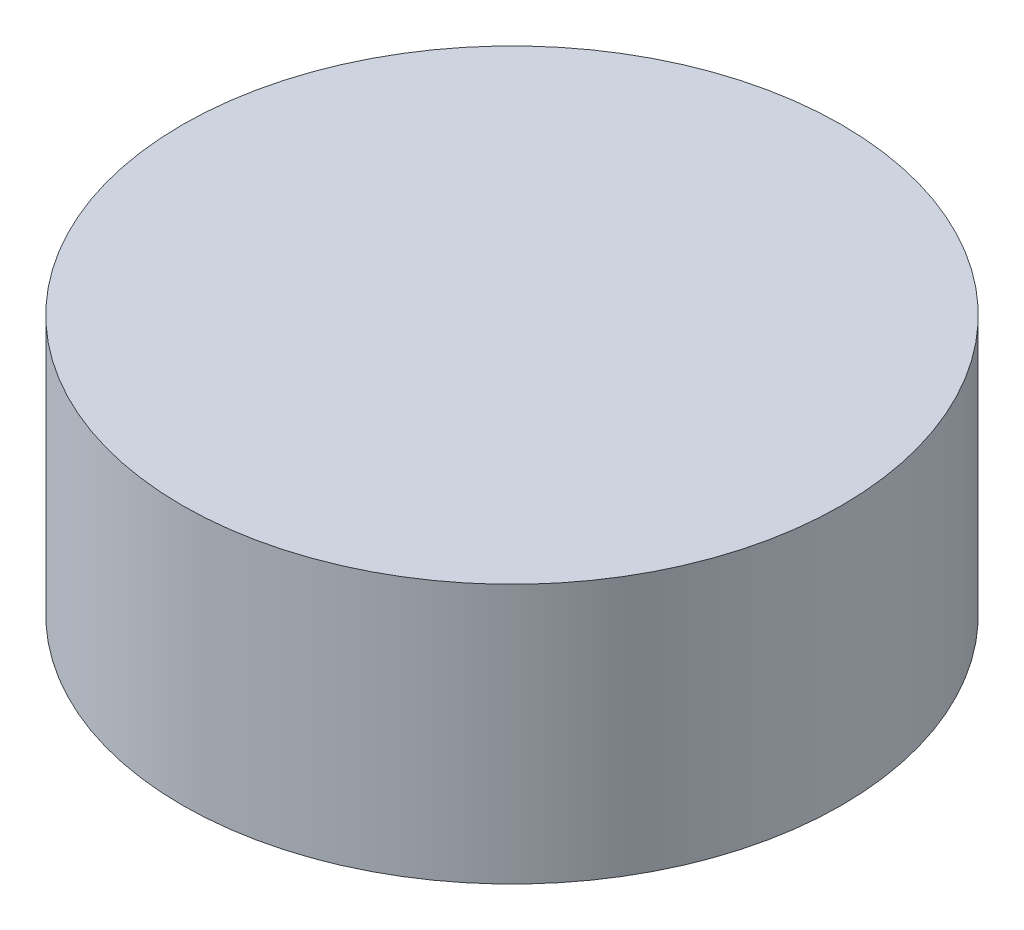
ISO-10303-21;
HEADER;
FILE_DESCRIPTION(('STEP AP214'),'2;1');
FILE_NAME('part.step','',(''),(''),'','','');
FILE_SCHEMA(('AUTOMOTIVE_DESIGN { 1 0 10303 214 1 1 1 1 }'));
ENDSEC;
DATA;
#1=APPLICATION_CONTEXT('core data for automotive mechanical design processes');
#2=APPLICATION_PROTOCOL_DEFINITION('international standard','automotive_design',2000,#1);
#3=PRODUCT_CONTEXT('',#1,'mechanical');
#4=PRODUCT('Part','Part','',(#3));
#5=PRODUCT_RELATED_PRODUCT_CATEGORY('part','',(#4));
#6=PRODUCT_DEFINITION_FORMATION('','',#4);
#7=PRODUCT_DEFINITION_CONTEXT('part definition',#1,'design');
#8=PRODUCT_DEFINITION('design','',#6,#7);
#9=PRODUCT_DEFINITION_SHAPE('','',#8);
#10=(LENGTH_UNIT() NAMED_UNIT(*) SI_UNIT(.MILLI.,.METRE.));
#11=(NAMED_UNIT(*) PLANE_ANGLE_UNIT() SI_UNIT($,.RADIAN.));
#12=(NAMED_UNIT(*) SI_UNIT($,.STERADIAN.) SOLID_ANGLE_UNIT());
#13=UNCERTAINTY_MEASURE_WITH_UNIT(LENGTH_MEASURE(1.E-05),#10,'distance_accuracy_value','');
#14=(GEOMETRIC_REPRESENTATION_CONTEXT(3) GLOBAL_UNCERTAINTY_ASSIGNED_CONTEXT((#13)) GLOBAL_UNIT_ASSIGNED_CONTEXT((#10,
#11,#12)) REPRESENTATION_CONTEXT('',''));
#15=CARTESIAN_POINT('',(0.,0.,0.));
#16=DIRECTION('',(0.,0.,1.));
#17=DIRECTION('',(1.,0.,0.));
#18=AXIS2_PLACEMENT_3D('',#15,#16,#17);
#19=CARTESIAN_POINT('',(0.,5.,0.));
#20=DIRECTION('',(0.,-1.,0.));
#21=DIRECTION('',(0.,0.,-1.));
#22=AXIS2_PLACEMENT_3D('',#19,#20,#21);
#23=CYLINDRICAL_SURFACE('',#22,6.35);
#24=CARTESIAN_POINT('',(0.,5.,0.));
#25=DIRECTION('',(0.,1.,0.));
#26=DIRECTION('',(0.,0.,1.));
#27=AXIS2_PLACEMENT_3D('',#24,#25,#26);
#28=CIRCLE('',#27,6.35);
#29=CARTESIAN_POINT('',(0.,5.,6.35));
#30=VERTEX_POINT('',#29);
#31=EDGE_CURVE('E11',#30,#30,#28,.T.);
#32=ORIENTED_EDGE('',*,*,#31,.F.);
#33=EDGE_LOOP('',(#32));
#34=FACE_BOUND('',#33,.T.);
#35=CARTESIAN_POINT('',(0.,0.,0.));
#36=DIRECTION('',(0.,1.,0.));
#37=DIRECTION('',(0.,0.,1.));
#38=AXIS2_PLACEMENT_3D('',#35,#36,#37);
#39=CIRCLE('',#38,6.35);
#40=CARTESIAN_POINT('',(0.,0.,6.35));
#41=VERTEX_POINT('',#40);
#42=EDGE_CURVE('E48',#41,#41,#39,.T.);
#43=ORIENTED_EDGE('',*,*,#42,.T.);
#44=EDGE_LOOP('',(#43));
#45=FACE_BOUND('',#44,.T.);
#46=ADVANCED_FACE('F45',(#34,#45),#23,.T.);
#47=CARTESIAN_POINT('',(0.,5.,0.));
#48=DIRECTION('',(0.,1.,0.));
#49=DIRECTION('',(0.,0.,1.));
#50=AXIS2_PLACEMENT_3D('',#47,#48,#49);
#51=PLANE('',#50);
#52=ORIENTED_EDGE('',*,*,#31,.T.);
#53=EDGE_LOOP('',(#52));
#54=FACE_BOUND('',#53,.T.);
#55=ADVANCED_FACE('F74',(#54),#51,.T.);
#56=CARTESIAN_POINT('',(0.,0.,0.));
#57=DIRECTION('',(0.,1.,0.));
#58=DIRECTION('',(0.,0.,1.));
#59=AXIS2_PLACEMENT_3D('',#56,#57,#58);
#60=PLANE('',#59);
#61=CARTESIAN_POINT('',(0.,0.,0.));
#62=DIRECTION('',(0.,-1.,0.));
#63=DIRECTION('',(0.,0.,-1.));
#64=AXIS2_PLACEMENT_3D('',#61,#62,#63);
#65=CIRCLE('',#64,1.13029999999999);
#66=CARTESIAN_POINT('',(0.,0.,-1.13029999999999));
#67=VERTEX_POINT('',#66);
#68=EDGE_CURVE('E64',#67,#67,#65,.T.);
#69=ORIENTED_EDGE('',*,*,#68,.F.);
#70=EDGE_LOOP('',(#69));
#71=FACE_BOUND('',#70,.T.);
#72=ORIENTED_EDGE('',*,*,#42,.F.);
#73=EDGE_LOOP('',(#72));
#74=FACE_BOUND('',#73,.T.);
#75=ADVANCED_FACE('F58',(#71,#74),#60,.F.);
#76=CARTESIAN_POINT('',(0.,2.286,0.));
#77=DIRECTION('',(0.,-1.,0.));
#78=DIRECTION('',(0.,0.,-1.));
#79=AXIS2_PLACEMENT_3D('',#76,#77,#78);
#80=CONICAL_SURFACE('',#79,1.1303,1.02974425867665);
#81=CARTESIAN_POINT('',(0.,2.96515275768685,0.));
#82=VERTEX_POINT('',#81);
#83=VERTEX_LOOP('',#82);
#84=FACE_BOUND('',#83,.T.);
#85=CARTESIAN_POINT('',(0.,2.286,0.));
#86=DIRECTION('',(0.,-1.,0.));
#87=DIRECTION('',(0.,0.,-1.));
#88=AXIS2_PLACEMENT_3D('',#85,#86,#87);
#89=CIRCLE('',#88,1.1303);
#90=CARTESIAN_POINT('',(0.,2.286,-1.1303));
#91=VERTEX_POINT('',#90);
#92=EDGE_CURVE('E62',#91,#91,#89,.T.);
#93=ORIENTED_EDGE('',*,*,#92,.T.);
#94=EDGE_LOOP('',(#93));
#95=FACE_BOUND('',#94,.T.);
#96=ADVANCED_FACE('F54',(#84,#95),#80,.F.);
#97=CARTESIAN_POINT('',(0.,0.,0.));
#98=DIRECTION('',(0.,-1.,0.));
#99=DIRECTION('',(0.,0.,-1.));
#100=AXIS2_PLACEMENT_3D('',#97,#98,#99);
#101=CYLINDRICAL_SURFACE('',#100,1.13029999999999);
#102=ORIENTED_EDGE('',*,*,#92,.F.);
#103=EDGE_LOOP('',(#102));
#104=FACE_BOUND('',#103,.T.);
#105=ORIENTED_EDGE('',*,*,#68,.T.);
#106=EDGE_LOOP('',(#105));
#107=FACE_BOUND('',#106,.T.);
#108=ADVANCED_FACE('F57',(#104,#107),#101,.F.);
#109=CLOSED_SHELL('',(#46,#55,#75,#96,#108));
#110=MANIFOLD_SOLID_BREP('B2',#109);
#111=ADVANCED_BREP_SHAPE_REPRESENTATION('',(#18,#110),#14);
#112=SHAPE_DEFINITION_REPRESENTATION(#9,#111);
ENDSEC;
END-ISO-10303-21;
